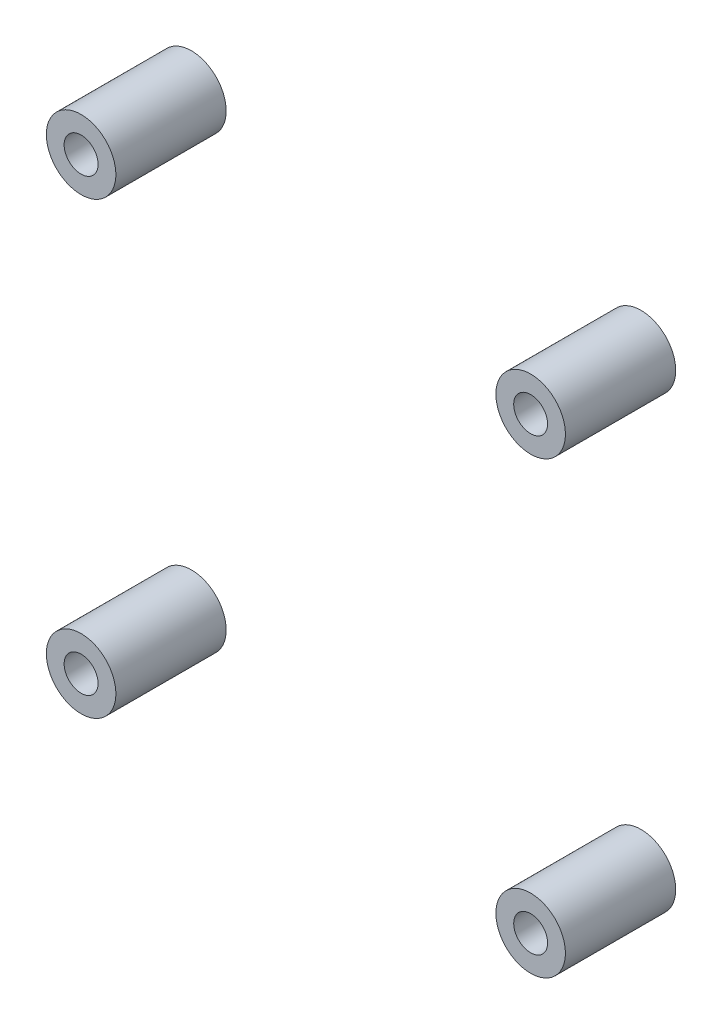
ISO-10303-21;
HEADER;
FILE_DESCRIPTION(('STEP AP214'),'2;1');
FILE_NAME('part.step','',(''),(''),'','','');
FILE_SCHEMA(('AUTOMOTIVE_DESIGN { 1 0 10303 214 1 1 1 1 }'));
ENDSEC;
DATA;
#1=APPLICATION_CONTEXT('core data for automotive mechanical design processes');
#2=APPLICATION_PROTOCOL_DEFINITION('international standard','automotive_design',2000,#1);
#3=PRODUCT_CONTEXT('',#1,'mechanical');
#4=PRODUCT('Part','Part','',(#3));
#5=PRODUCT_RELATED_PRODUCT_CATEGORY('part','',(#4));
#6=PRODUCT_DEFINITION_FORMATION('','',#4);
#7=PRODUCT_DEFINITION_CONTEXT('part definition',#1,'design');
#8=PRODUCT_DEFINITION('design','',#6,#7);
#9=PRODUCT_DEFINITION_SHAPE('','',#8);
#10=(LENGTH_UNIT() NAMED_UNIT(*) SI_UNIT(.MILLI.,.METRE.));
#11=(NAMED_UNIT(*) PLANE_ANGLE_UNIT() SI_UNIT($,.RADIAN.));
#12=(NAMED_UNIT(*) SI_UNIT($,.STERADIAN.) SOLID_ANGLE_UNIT());
#13=UNCERTAINTY_MEASURE_WITH_UNIT(LENGTH_MEASURE(1.E-05),#10,'distance_accuracy_value','');
#14=(GEOMETRIC_REPRESENTATION_CONTEXT(3) GLOBAL_UNCERTAINTY_ASSIGNED_CONTEXT((#13)) GLOBAL_UNIT_ASSIGNED_CONTEXT((#10,
#11,#12)) REPRESENTATION_CONTEXT('',''));
#15=CARTESIAN_POINT('',(0.,0.,0.));
#16=DIRECTION('',(0.,0.,1.));
#17=DIRECTION('',(1.,0.,0.));
#18=AXIS2_PLACEMENT_3D('',#15,#16,#17);
#19=CARTESIAN_POINT('',(-40.9973011493594,-17.8109634934686,-40.8004177799882));
#20=DIRECTION('',(0.,0.,-1.));
#21=DIRECTION('',(-1.,0.,0.));
#22=AXIS2_PLACEMENT_3D('',#19,#20,#21);
#23=PLANE('',#22);
#24=CARTESIAN_POINT('',(-40.9973011493594,-17.8109634934686,-40.8004177799882));
#25=DIRECTION('',(0.,0.,-1.));
#26=DIRECTION('',(-1.,0.,0.));
#27=AXIS2_PLACEMENT_3D('',#24,#25,#26);
#28=CIRCLE('',#27,2.52);
#29=CARTESIAN_POINT('',(-43.5173011493594,-17.8109634934686,-40.8004177799882));
#30=VERTEX_POINT('',#29);
#31=EDGE_CURVE('E11',#30,#30,#28,.T.);
#32=ORIENTED_EDGE('',*,*,#31,.T.);
#33=EDGE_LOOP('',(#32));
#34=FACE_BOUND('',#33,.T.);
#35=CARTESIAN_POINT('',(-40.9973011493594,-17.8109634934686,-40.8004177799882));
#36=DIRECTION('',(0.,0.,-1.));
#37=DIRECTION('',(-1.,0.,0.));
#38=AXIS2_PLACEMENT_3D('',#35,#36,#37);
#39=CIRCLE('',#38,1.22949999999937);
#40=CARTESIAN_POINT('',(-42.2268011493587,-17.8109634934686,-40.8004177799882));
#41=VERTEX_POINT('',#40);
#42=EDGE_CURVE('E59',#41,#41,#39,.T.);
#43=ORIENTED_EDGE('',*,*,#42,.F.);
#44=EDGE_LOOP('',(#43));
#45=FACE_BOUND('',#44,.T.);
#46=ADVANCED_FACE('F45',(#34,#45),#23,.T.);
#47=CARTESIAN_POINT('',(-40.9973011493594,-17.8109634934686,-32.8004177799882));
#48=DIRECTION('',(0.,0.,-1.));
#49=DIRECTION('',(-1.,0.,0.));
#50=AXIS2_PLACEMENT_3D('',#47,#48,#49);
#51=PLANE('',#50);
#52=CARTESIAN_POINT('',(-40.9973011493594,-17.8109634934686,-32.8004177799882));
#53=DIRECTION('',(0.,0.,-1.));
#54=DIRECTION('',(-1.,0.,0.));
#55=AXIS2_PLACEMENT_3D('',#52,#53,#54);
#56=CIRCLE('',#55,2.52);
#57=CARTESIAN_POINT('',(-43.5173011493594,-17.8109634934686,-32.8004177799882));
#58=VERTEX_POINT('',#57);
#59=EDGE_CURVE('E49',#58,#58,#56,.T.);
#60=ORIENTED_EDGE('',*,*,#59,.F.);
#61=EDGE_LOOP('',(#60));
#62=FACE_BOUND('',#61,.T.);
#63=CARTESIAN_POINT('',(-40.9973011493594,-17.8109634934686,-32.8004177799882));
#64=DIRECTION('',(0.,0.,-1.));
#65=DIRECTION('',(-1.,0.,0.));
#66=AXIS2_PLACEMENT_3D('',#63,#64,#65);
#67=CIRCLE('',#66,1.22949999999937);
#68=CARTESIAN_POINT('',(-42.2268011493587,-17.8109634934686,-32.8004177799882));
#69=VERTEX_POINT('',#68);
#70=EDGE_CURVE('E61',#69,#69,#67,.T.);
#71=ORIENTED_EDGE('',*,*,#70,.T.);
#72=EDGE_LOOP('',(#71));
#73=FACE_BOUND('',#72,.T.);
#74=ADVANCED_FACE('F72',(#62,#73),#51,.F.);
#75=CARTESIAN_POINT('',(-40.9973011493594,-17.8109634934686,-40.8004177799882));
#76=DIRECTION('',(0.,0.,1.));
#77=DIRECTION('',(1.,0.,0.));
#78=AXIS2_PLACEMENT_3D('',#75,#76,#77);
#79=CYLINDRICAL_SURFACE('',#78,2.52);
#80=ORIENTED_EDGE('',*,*,#31,.F.);
#81=EDGE_LOOP('',(#80));
#82=FACE_BOUND('',#81,.T.);
#83=ORIENTED_EDGE('',*,*,#59,.T.);
#84=EDGE_LOOP('',(#83));
#85=FACE_BOUND('',#84,.T.);
#86=ADVANCED_FACE('F47',(#82,#85),#79,.T.);
#87=CARTESIAN_POINT('',(-40.9973011493594,-17.8109634934686,-40.8004177799882));
#88=DIRECTION('',(0.,0.,1.));
#89=DIRECTION('',(1.,0.,0.));
#90=AXIS2_PLACEMENT_3D('',#87,#88,#89);
#91=CYLINDRICAL_SURFACE('',#90,1.22949999999937);
#92=ORIENTED_EDGE('',*,*,#42,.T.);
#93=EDGE_LOOP('',(#92));
#94=FACE_BOUND('',#93,.T.);
#95=ORIENTED_EDGE('',*,*,#70,.F.);
#96=EDGE_LOOP('',(#95));
#97=FACE_BOUND('',#96,.T.);
#98=ADVANCED_FACE('F68',(#94,#97),#91,.F.);
#99=CLOSED_SHELL('',(#46,#74,#86,#98));
#100=MANIFOLD_SOLID_BREP('B2',#99);
#101=CARTESIAN_POINT('',(-8.39967907406094,-17.8109634934673,-40.8004177799882));
#102=DIRECTION('',(0.,0.,-1.));
#103=DIRECTION('',(-1.,0.,0.));
#104=AXIS2_PLACEMENT_3D('',#101,#102,#103);
#105=PLANE('',#104);
#106=CARTESIAN_POINT('',(-8.39967907406094,-17.8109634934673,-40.8004177799882));
#107=DIRECTION('',(0.,0.,-1.));
#108=DIRECTION('',(-1.,0.,0.));
#109=AXIS2_PLACEMENT_3D('',#106,#107,#108);
#110=CIRCLE('',#109,2.52);
#111=CARTESIAN_POINT('',(-10.9196790740609,-17.8109634934673,-40.8004177799882));
#112=VERTEX_POINT('',#111);
#113=EDGE_CURVE('E44',#112,#112,#110,.T.);
#114=ORIENTED_EDGE('',*,*,#113,.T.);
#115=EDGE_LOOP('',(#114));
#116=FACE_BOUND('',#115,.T.);
#117=CARTESIAN_POINT('',(-8.39967907406094,-17.8109634934673,-40.8004177799882));
#118=DIRECTION('',(0.,0.,-1.));
#119=DIRECTION('',(-1.,0.,0.));
#120=AXIS2_PLACEMENT_3D('',#117,#118,#119);
#121=CIRCLE('',#120,1.22949999999937);
#122=CARTESIAN_POINT('',(-9.62917907406031,-17.8109634934673,-40.8004177799882));
#123=VERTEX_POINT('',#122);
#124=EDGE_CURVE('E136',#123,#123,#121,.T.);
#125=ORIENTED_EDGE('',*,*,#124,.F.);
#126=EDGE_LOOP('',(#125));
#127=FACE_BOUND('',#126,.T.);
#128=ADVANCED_FACE('F122',(#116,#127),#105,.T.);
#129=CARTESIAN_POINT('',(-8.39967907406094,-17.8109634934673,-32.8004177799882));
#130=DIRECTION('',(0.,0.,-1.));
#131=DIRECTION('',(-1.,0.,0.));
#132=AXIS2_PLACEMENT_3D('',#129,#130,#131);
#133=PLANE('',#132);
#134=CARTESIAN_POINT('',(-8.39967907406094,-17.8109634934673,-32.8004177799882));
#135=DIRECTION('',(0.,0.,-1.));
#136=DIRECTION('',(-1.,0.,0.));
#137=AXIS2_PLACEMENT_3D('',#134,#135,#136);
#138=CIRCLE('',#137,2.52);
#139=CARTESIAN_POINT('',(-10.9196790740609,-17.8109634934673,-32.8004177799882));
#140=VERTEX_POINT('',#139);
#141=EDGE_CURVE('E126',#140,#140,#138,.T.);
#142=ORIENTED_EDGE('',*,*,#141,.F.);
#143=EDGE_LOOP('',(#142));
#144=FACE_BOUND('',#143,.T.);
#145=CARTESIAN_POINT('',(-8.39967907406094,-17.8109634934673,-32.8004177799882));
#146=DIRECTION('',(0.,0.,-1.));
#147=DIRECTION('',(-1.,0.,0.));
#148=AXIS2_PLACEMENT_3D('',#145,#146,#147);
#149=CIRCLE('',#148,1.22949999999937);
#150=CARTESIAN_POINT('',(-9.62917907406031,-17.8109634934673,-32.8004177799882));
#151=VERTEX_POINT('',#150);
#152=EDGE_CURVE('E138',#151,#151,#149,.T.);
#153=ORIENTED_EDGE('',*,*,#152,.T.);
#154=EDGE_LOOP('',(#153));
#155=FACE_BOUND('',#154,.T.);
#156=ADVANCED_FACE('F149',(#144,#155),#133,.F.);
#157=CARTESIAN_POINT('',(-8.39967907406094,-17.8109634934673,-40.8004177799882));
#158=DIRECTION('',(0.,0.,1.));
#159=DIRECTION('',(1.,0.,0.));
#160=AXIS2_PLACEMENT_3D('',#157,#158,#159);
#161=CYLINDRICAL_SURFACE('',#160,2.52);
#162=ORIENTED_EDGE('',*,*,#113,.F.);
#163=EDGE_LOOP('',(#162));
#164=FACE_BOUND('',#163,.T.);
#165=ORIENTED_EDGE('',*,*,#141,.T.);
#166=EDGE_LOOP('',(#165));
#167=FACE_BOUND('',#166,.T.);
#168=ADVANCED_FACE('F124',(#164,#167),#161,.T.);
#169=CARTESIAN_POINT('',(-8.39967907406094,-17.8109634934673,-40.8004177799882));
#170=DIRECTION('',(0.,0.,1.));
#171=DIRECTION('',(1.,0.,0.));
#172=AXIS2_PLACEMENT_3D('',#169,#170,#171);
#173=CYLINDRICAL_SURFACE('',#172,1.22949999999937);
#174=ORIENTED_EDGE('',*,*,#124,.T.);
#175=EDGE_LOOP('',(#174));
#176=FACE_BOUND('',#175,.T.);
#177=ORIENTED_EDGE('',*,*,#152,.F.);
#178=EDGE_LOOP('',(#177));
#179=FACE_BOUND('',#178,.T.);
#180=ADVANCED_FACE('F145',(#176,#179),#173,.F.);
#181=CLOSED_SHELL('',(#128,#156,#168,#180));
#182=MANIFOLD_SOLID_BREP('B6',#181);
#183=CARTESIAN_POINT('',(-8.39967907406238,14.7866585818311,-40.8004177799882));
#184=DIRECTION('',(0.,0.,-1.));
#185=DIRECTION('',(-1.,0.,0.));
#186=AXIS2_PLACEMENT_3D('',#183,#184,#185);
#187=PLANE('',#186);
#188=CARTESIAN_POINT('',(-8.39967907406238,14.7866585818311,-40.8004177799882));
#189=DIRECTION('',(0.,0.,-1.));
#190=DIRECTION('',(-1.,0.,0.));
#191=AXIS2_PLACEMENT_3D('',#188,#189,#190);
#192=CIRCLE('',#191,2.52000000000001);
#193=CARTESIAN_POINT('',(-10.9196790740624,14.7866585818311,-40.8004177799882));
#194=VERTEX_POINT('',#193);
#195=EDGE_CURVE('E121',#194,#194,#192,.T.);
#196=ORIENTED_EDGE('',*,*,#195,.T.);
#197=EDGE_LOOP('',(#196));
#198=FACE_BOUND('',#197,.T.);
#199=CARTESIAN_POINT('',(-8.39967907406238,14.7866585818311,-40.8004177799882));
#200=DIRECTION('',(0.,0.,-1.));
#201=DIRECTION('',(-1.,0.,0.));
#202=AXIS2_PLACEMENT_3D('',#199,#200,#201);
#203=CIRCLE('',#202,1.22949999999938);
#204=CARTESIAN_POINT('',(-9.62917907406175,14.7866585818311,-40.8004177799882));
#205=VERTEX_POINT('',#204);
#206=EDGE_CURVE('E212',#205,#205,#203,.T.);
#207=ORIENTED_EDGE('',*,*,#206,.F.);
#208=EDGE_LOOP('',(#207));
#209=FACE_BOUND('',#208,.T.);
#210=ADVANCED_FACE('F198',(#198,#209),#187,.T.);
#211=CARTESIAN_POINT('',(-8.39967907406238,14.7866585818311,-32.8004177799882));
#212=DIRECTION('',(0.,0.,-1.));
#213=DIRECTION('',(-1.,0.,0.));
#214=AXIS2_PLACEMENT_3D('',#211,#212,#213);
#215=PLANE('',#214);
#216=CARTESIAN_POINT('',(-8.39967907406238,14.7866585818311,-32.8004177799882));
#217=DIRECTION('',(0.,0.,-1.));
#218=DIRECTION('',(-1.,0.,0.));
#219=AXIS2_PLACEMENT_3D('',#216,#217,#218);
#220=CIRCLE('',#219,2.52000000000001);
#221=CARTESIAN_POINT('',(-10.9196790740624,14.7866585818311,-32.8004177799882));
#222=VERTEX_POINT('',#221);
#223=EDGE_CURVE('E202',#222,#222,#220,.T.);
#224=ORIENTED_EDGE('',*,*,#223,.F.);
#225=EDGE_LOOP('',(#224));
#226=FACE_BOUND('',#225,.T.);
#227=CARTESIAN_POINT('',(-8.39967907406238,14.7866585818311,-32.8004177799882));
#228=DIRECTION('',(0.,0.,-1.));
#229=DIRECTION('',(-1.,0.,0.));
#230=AXIS2_PLACEMENT_3D('',#227,#228,#229);
#231=CIRCLE('',#230,1.22949999999938);
#232=CARTESIAN_POINT('',(-9.62917907406175,14.7866585818311,-32.8004177799882));
#233=VERTEX_POINT('',#232);
#234=EDGE_CURVE('E214',#233,#233,#231,.T.);
#235=ORIENTED_EDGE('',*,*,#234,.T.);
#236=EDGE_LOOP('',(#235));
#237=FACE_BOUND('',#236,.T.);
#238=ADVANCED_FACE('F225',(#226,#237),#215,.F.);
#239=CARTESIAN_POINT('',(-8.39967907406238,14.7866585818311,-40.8004177799882));
#240=DIRECTION('',(0.,0.,1.));
#241=DIRECTION('',(1.,0.,0.));
#242=AXIS2_PLACEMENT_3D('',#239,#240,#241);
#243=CYLINDRICAL_SURFACE('',#242,2.52000000000001);
#244=ORIENTED_EDGE('',*,*,#195,.F.);
#245=EDGE_LOOP('',(#244));
#246=FACE_BOUND('',#245,.T.);
#247=ORIENTED_EDGE('',*,*,#223,.T.);
#248=EDGE_LOOP('',(#247));
#249=FACE_BOUND('',#248,.T.);
#250=ADVANCED_FACE('F200',(#246,#249),#243,.T.);
#251=CARTESIAN_POINT('',(-8.39967907406238,14.7866585818311,-40.8004177799882));
#252=DIRECTION('',(0.,0.,1.));
#253=DIRECTION('',(1.,0.,0.));
#254=AXIS2_PLACEMENT_3D('',#251,#252,#253);
#255=CYLINDRICAL_SURFACE('',#254,1.22949999999938);
#256=ORIENTED_EDGE('',*,*,#206,.T.);
#257=EDGE_LOOP('',(#256));
#258=FACE_BOUND('',#257,.T.);
#259=ORIENTED_EDGE('',*,*,#234,.F.);
#260=EDGE_LOOP('',(#259));
#261=FACE_BOUND('',#260,.T.);
#262=ADVANCED_FACE('F221',(#258,#261),#255,.F.);
#263=CLOSED_SHELL('',(#210,#238,#250,#262));
#264=MANIFOLD_SOLID_BREP('B39',#263);
#265=CARTESIAN_POINT('',(-40.9973011493608,14.7866585818296,-40.8004177799882));
#266=DIRECTION('',(0.,0.,-1.));
#267=DIRECTION('',(-1.,0.,0.));
#268=AXIS2_PLACEMENT_3D('',#265,#266,#267);
#269=PLANE('',#268);
#270=CARTESIAN_POINT('',(-40.9973011493608,14.7866585818296,-40.8004177799882));
#271=DIRECTION('',(0.,0.,-1.));
#272=DIRECTION('',(-1.,0.,0.));
#273=AXIS2_PLACEMENT_3D('',#270,#271,#272);
#274=CIRCLE('',#273,2.52);
#275=CARTESIAN_POINT('',(-43.5173011493608,14.7866585818296,-40.8004177799882));
#276=VERTEX_POINT('',#275);
#277=EDGE_CURVE('E197',#276,#276,#274,.T.);
#278=ORIENTED_EDGE('',*,*,#277,.T.);
#279=EDGE_LOOP('',(#278));
#280=FACE_BOUND('',#279,.T.);
#281=CARTESIAN_POINT('',(-40.9973011493608,14.7866585818296,-40.8004177799882));
#282=DIRECTION('',(0.,0.,-1.));
#283=DIRECTION('',(-1.,0.,0.));
#284=AXIS2_PLACEMENT_3D('',#281,#282,#283);
#285=CIRCLE('',#284,1.22949999999937);
#286=CARTESIAN_POINT('',(-42.2268011493602,14.7866585818296,-40.8004177799882));
#287=VERTEX_POINT('',#286);
#288=EDGE_CURVE('E281',#287,#287,#285,.T.);
#289=ORIENTED_EDGE('',*,*,#288,.F.);
#290=EDGE_LOOP('',(#289));
#291=FACE_BOUND('',#290,.T.);
#292=ADVANCED_FACE('F267',(#280,#291),#269,.T.);
#293=CARTESIAN_POINT('',(-40.9973011493608,14.7866585818296,-32.8004177799882));
#294=DIRECTION('',(0.,0.,-1.));
#295=DIRECTION('',(-1.,0.,0.));
#296=AXIS2_PLACEMENT_3D('',#293,#294,#295);
#297=PLANE('',#296);
#298=CARTESIAN_POINT('',(-40.9973011493608,14.7866585818296,-32.8004177799882));
#299=DIRECTION('',(0.,0.,-1.));
#300=DIRECTION('',(-1.,0.,0.));
#301=AXIS2_PLACEMENT_3D('',#298,#299,#300);
#302=CIRCLE('',#301,2.52);
#303=CARTESIAN_POINT('',(-43.5173011493608,14.7866585818296,-32.8004177799882));
#304=VERTEX_POINT('',#303);
#305=EDGE_CURVE('E271',#304,#304,#302,.T.);
#306=ORIENTED_EDGE('',*,*,#305,.F.);
#307=EDGE_LOOP('',(#306));
#308=FACE_BOUND('',#307,.T.);
#309=CARTESIAN_POINT('',(-40.9973011493608,14.7866585818296,-32.8004177799882));
#310=DIRECTION('',(0.,0.,-1.));
#311=DIRECTION('',(-1.,0.,0.));
#312=AXIS2_PLACEMENT_3D('',#309,#310,#311);
#313=CIRCLE('',#312,1.22949999999937);
#314=CARTESIAN_POINT('',(-42.2268011493602,14.7866585818296,-32.8004177799882));
#315=VERTEX_POINT('',#314);
#316=EDGE_CURVE('E283',#315,#315,#313,.T.);
#317=ORIENTED_EDGE('',*,*,#316,.T.);
#318=EDGE_LOOP('',(#317));
#319=FACE_BOUND('',#318,.T.);
#320=ADVANCED_FACE('F294',(#308,#319),#297,.F.);
#321=CARTESIAN_POINT('',(-40.9973011493608,14.7866585818296,-40.8004177799882));
#322=DIRECTION('',(0.,0.,1.));
#323=DIRECTION('',(1.,0.,0.));
#324=AXIS2_PLACEMENT_3D('',#321,#322,#323);
#325=CYLINDRICAL_SURFACE('',#324,2.52);
#326=ORIENTED_EDGE('',*,*,#277,.F.);
#327=EDGE_LOOP('',(#326));
#328=FACE_BOUND('',#327,.T.);
#329=ORIENTED_EDGE('',*,*,#305,.T.);
#330=EDGE_LOOP('',(#329));
#331=FACE_BOUND('',#330,.T.);
#332=ADVANCED_FACE('F269',(#328,#331),#325,.T.);
#333=CARTESIAN_POINT('',(-40.9973011493608,14.7866585818296,-40.8004177799882));
#334=DIRECTION('',(0.,0.,1.));
#335=DIRECTION('',(1.,0.,0.));
#336=AXIS2_PLACEMENT_3D('',#333,#334,#335);
#337=CYLINDRICAL_SURFACE('',#336,1.22949999999937);
#338=ORIENTED_EDGE('',*,*,#288,.T.);
#339=EDGE_LOOP('',(#338));
#340=FACE_BOUND('',#339,.T.);
#341=ORIENTED_EDGE('',*,*,#316,.F.);
#342=EDGE_LOOP('',(#341));
#343=FACE_BOUND('',#342,.T.);
#344=ADVANCED_FACE('F290',(#340,#343),#337,.F.);
#345=CLOSED_SHELL('',(#292,#320,#332,#344));
#346=MANIFOLD_SOLID_BREP('B116',#345);
#347=ADVANCED_BREP_SHAPE_REPRESENTATION('',(#18,#100,#182,#264,#346),#14);
#348=SHAPE_DEFINITION_REPRESENTATION(#9,#347);
ENDSEC;
END-ISO-10303-21;
